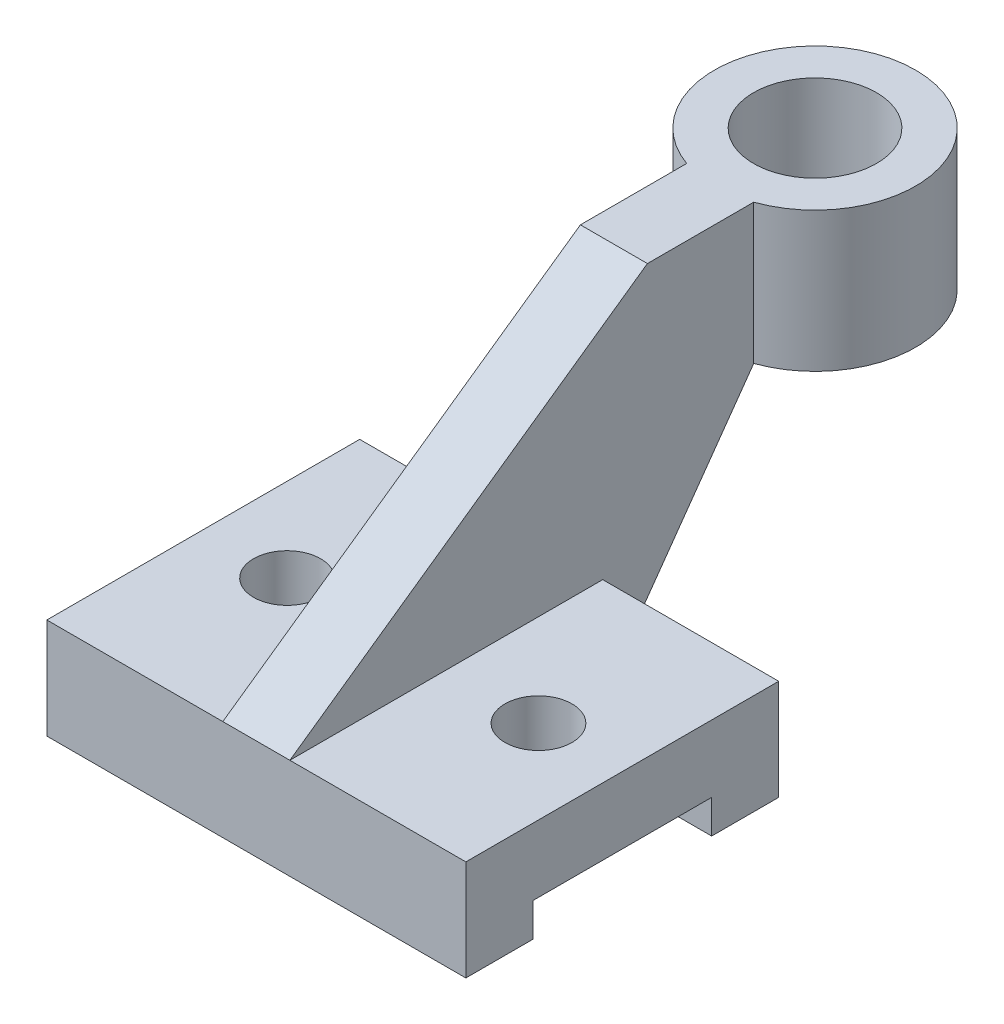
ISO-10303-21;
HEADER;
FILE_DESCRIPTION(('STEP AP214'),'2;1');
FILE_NAME('part.step','',(''),(''),'','','');
FILE_SCHEMA(('AUTOMOTIVE_DESIGN { 1 0 10303 214 1 1 1 1 }'));
ENDSEC;
DATA;
#1=APPLICATION_CONTEXT('core data for automotive mechanical design processes');
#2=APPLICATION_PROTOCOL_DEFINITION('international standard','automotive_design',2000,#1);
#3=PRODUCT_CONTEXT('',#1,'mechanical');
#4=PRODUCT('Part','Part','',(#3));
#5=PRODUCT_RELATED_PRODUCT_CATEGORY('part','',(#4));
#6=PRODUCT_DEFINITION_FORMATION('','',#4);
#7=PRODUCT_DEFINITION_CONTEXT('part definition',#1,'design');
#8=PRODUCT_DEFINITION('design','',#6,#7);
#9=PRODUCT_DEFINITION_SHAPE('','',#8);
#10=(LENGTH_UNIT() NAMED_UNIT(*) SI_UNIT(.MILLI.,.METRE.));
#11=(NAMED_UNIT(*) PLANE_ANGLE_UNIT() SI_UNIT($,.RADIAN.));
#12=(NAMED_UNIT(*) SI_UNIT($,.STERADIAN.) SOLID_ANGLE_UNIT());
#13=UNCERTAINTY_MEASURE_WITH_UNIT(LENGTH_MEASURE(1.E-05),#10,'distance_accuracy_value','');
#14=(GEOMETRIC_REPRESENTATION_CONTEXT(3) GLOBAL_UNCERTAINTY_ASSIGNED_CONTEXT((#13)) GLOBAL_UNIT_ASSIGNED_CONTEXT((#10,
#11,#12)) REPRESENTATION_CONTEXT('',''));
#15=CARTESIAN_POINT('',(0.,0.,0.));
#16=DIRECTION('',(0.,0.,1.));
#17=DIRECTION('',(1.,0.,0.));
#18=AXIS2_PLACEMENT_3D('',#15,#16,#17);
#19=CARTESIAN_POINT('',(-37.5,18.,-28.));
#20=DIRECTION('',(0.,0.,1.));
#21=DIRECTION('',(1.,0.,0.));
#22=AXIS2_PLACEMENT_3D('',#19,#20,#21);
#23=PLANE('',#22);
#24=DIRECTION('',(0.,-1.,0.));
#25=VECTOR('',#24,1.);
#26=CARTESIAN_POINT('',(6.,18.,-28.));
#27=LINE('',#26,#25);
#28=CARTESIAN_POINT('',(6.,18.,-28.));
#29=VERTEX_POINT('',#28);
#30=CARTESIAN_POINT('',(6.,0.,-28.));
#31=VERTEX_POINT('',#30);
#32=EDGE_CURVE('E184',#29,#31,#27,.T.);
#33=ORIENTED_EDGE('',*,*,#32,.F.);
#34=DIRECTION('',(-1.,0.,0.));
#35=VECTOR('',#34,1.);
#36=CARTESIAN_POINT('',(-37.5,18.,-28.));
#37=LINE('',#36,#35);
#38=CARTESIAN_POINT('',(37.5,18.,-28.));
#39=VERTEX_POINT('',#38);
#40=EDGE_CURVE('E246',#39,#29,#37,.T.);
#41=ORIENTED_EDGE('',*,*,#40,.F.);
#42=DIRECTION('',(0.,-1.,0.));
#43=VECTOR('',#42,1.);
#44=CARTESIAN_POINT('',(37.5,18.,-28.));
#45=LINE('',#44,#43);
#46=CARTESIAN_POINT('',(37.5,0.,-28.));
#47=VERTEX_POINT('',#46);
#48=EDGE_CURVE('E11',#39,#47,#45,.T.);
#49=ORIENTED_EDGE('',*,*,#48,.T.);
#50=DIRECTION('',(-1.,0.,0.));
#51=VECTOR('',#50,1.);
#52=CARTESIAN_POINT('',(-37.5,0.,-28.));
#53=LINE('',#52,#51);
#54=EDGE_CURVE('E258',#47,#31,#53,.T.);
#55=ORIENTED_EDGE('',*,*,#54,.T.);
#56=EDGE_LOOP('',(#33,#41,#49,#55));
#57=FACE_BOUND('',#56,.T.);
#58=ADVANCED_FACE('F39',(#57),#23,.F.);
#59=CARTESIAN_POINT('',(0.,18.,0.));
#60=DIRECTION('',(0.,-1.,0.));
#61=DIRECTION('',(0.,0.,-1.));
#62=AXIS2_PLACEMENT_3D('',#59,#60,#61);
#63=PLANE('',#62);
#64=CARTESIAN_POINT('',(22.5,18.,0.));
#65=DIRECTION('',(0.,1.,0.));
#66=DIRECTION('',(0.,0.,1.));
#67=AXIS2_PLACEMENT_3D('',#64,#65,#66);
#68=CIRCLE('',#67,6.);
#69=CARTESIAN_POINT('',(22.5,18.,6.));
#70=VERTEX_POINT('',#69);
#71=EDGE_CURVE('E237',#70,#70,#68,.T.);
#72=ORIENTED_EDGE('',*,*,#71,.F.);
#73=EDGE_LOOP('',(#72));
#74=FACE_BOUND('',#73,.T.);
#75=DIRECTION('',(0.,0.,-1.));
#76=VECTOR('',#75,1.);
#77=CARTESIAN_POINT('',(6.,18.,28.));
#78=LINE('',#77,#76);
#79=CARTESIAN_POINT('',(6.,18.,28.));
#80=VERTEX_POINT('',#79);
#81=EDGE_CURVE('E55',#80,#29,#78,.T.);
#82=ORIENTED_EDGE('',*,*,#81,.F.);
#83=DIRECTION('',(1.,0.,0.));
#84=VECTOR('',#83,1.);
#85=CARTESIAN_POINT('',(-37.5,18.,28.));
#86=LINE('',#85,#84);
#87=CARTESIAN_POINT('',(37.5,18.,28.));
#88=VERTEX_POINT('',#87);
#89=EDGE_CURVE('E250',#80,#88,#86,.T.);
#90=ORIENTED_EDGE('',*,*,#89,.T.);
#91=DIRECTION('',(0.,0.,-1.));
#92=VECTOR('',#91,1.);
#93=CARTESIAN_POINT('',(37.5,18.,28.));
#94=LINE('',#93,#92);
#95=EDGE_CURVE('E241',#88,#39,#94,.T.);
#96=ORIENTED_EDGE('',*,*,#95,.T.);
#97=ORIENTED_EDGE('',*,*,#40,.T.);
#98=EDGE_LOOP('',(#82,#90,#96,#97));
#99=FACE_BOUND('',#98,.T.);
#100=ADVANCED_FACE('F306',(#74,#99),#63,.F.);
#101=CARTESIAN_POINT('',(0.,0.,0.));
#102=DIRECTION('',(0.,-1.,0.));
#103=DIRECTION('',(0.,0.,-1.));
#104=AXIS2_PLACEMENT_3D('',#101,#102,#103);
#105=PLANE('',#104);
#106=DIRECTION('',(1.,0.,0.));
#107=VECTOR('',#106,1.);
#108=CARTESIAN_POINT('',(-37.5,0.,16.));
#109=LINE('',#108,#107);
#110=CARTESIAN_POINT('',(-37.5,0.,16.));
#111=VERTEX_POINT('',#110);
#112=CARTESIAN_POINT('',(37.5,0.,16.));
#113=VERTEX_POINT('',#112);
#114=EDGE_CURVE('E223',#111,#113,#109,.T.);
#115=ORIENTED_EDGE('',*,*,#114,.T.);
#116=DIRECTION('',(0.,0.,-1.));
#117=VECTOR('',#116,1.);
#118=CARTESIAN_POINT('',(37.5,0.,28.));
#119=LINE('',#118,#117);
#120=CARTESIAN_POINT('',(37.5,0.,28.));
#121=VERTEX_POINT('',#120);
#122=EDGE_CURVE('E254',#121,#113,#119,.T.);
#123=ORIENTED_EDGE('',*,*,#122,.F.);
#124=DIRECTION('',(1.,0.,0.));
#125=VECTOR('',#124,1.);
#126=CARTESIAN_POINT('',(-37.5,0.,28.));
#127=LINE('',#126,#125);
#128=CARTESIAN_POINT('',(-37.5,0.,28.));
#129=VERTEX_POINT('',#128);
#130=EDGE_CURVE('E245',#129,#121,#127,.T.);
#131=ORIENTED_EDGE('',*,*,#130,.F.);
#132=DIRECTION('',(0.,0.,1.));
#133=VECTOR('',#132,1.);
#134=CARTESIAN_POINT('',(-37.5,0.,28.));
#135=LINE('',#134,#133);
#136=EDGE_CURVE('E261',#111,#129,#135,.T.);
#137=ORIENTED_EDGE('',*,*,#136,.F.);
#138=EDGE_LOOP('',(#115,#123,#131,#137));
#139=FACE_BOUND('',#138,.T.);
#140=ADVANCED_FACE('F301',(#139),#105,.T.);
#141=CARTESIAN_POINT('',(37.5,18.,28.));
#142=DIRECTION('',(-1.,0.,0.));
#143=DIRECTION('',(0.,0.,1.));
#144=AXIS2_PLACEMENT_3D('',#141,#142,#143);
#145=PLANE('',#144);
#146=ORIENTED_EDGE('',*,*,#122,.T.);
#147=DIRECTION('',(0.,-1.,0.));
#148=VECTOR('',#147,1.);
#149=CARTESIAN_POINT('',(37.5,0.,16.));
#150=LINE('',#149,#148);
#151=CARTESIAN_POINT('',(37.5,6.,16.));
#152=VERTEX_POINT('',#151);
#153=EDGE_CURVE('E210',#152,#113,#150,.T.);
#154=ORIENTED_EDGE('',*,*,#153,.F.);
#155=DIRECTION('',(0.,0.,1.));
#156=VECTOR('',#155,1.);
#157=CARTESIAN_POINT('',(37.5,6.,16.));
#158=LINE('',#157,#156);
#159=CARTESIAN_POINT('',(37.5,6.,-16.));
#160=VERTEX_POINT('',#159);
#161=EDGE_CURVE('E219',#160,#152,#158,.T.);
#162=ORIENTED_EDGE('',*,*,#161,.F.);
#163=DIRECTION('',(0.,1.,0.));
#164=VECTOR('',#163,1.);
#165=CARTESIAN_POINT('',(37.5,0.,-16.));
#166=LINE('',#165,#164);
#167=CARTESIAN_POINT('',(37.5,0.,-16.));
#168=VERTEX_POINT('',#167);
#169=EDGE_CURVE('E205',#168,#160,#166,.T.);
#170=ORIENTED_EDGE('',*,*,#169,.F.);
#171=EDGE_CURVE('E240',#168,#47,#119,.T.);
#172=ORIENTED_EDGE('',*,*,#171,.T.);
#173=ORIENTED_EDGE('',*,*,#48,.F.);
#174=ORIENTED_EDGE('',*,*,#95,.F.);
#175=DIRECTION('',(0.,-1.,0.));
#176=VECTOR('',#175,1.);
#177=CARTESIAN_POINT('',(37.5,18.,28.));
#178=LINE('',#177,#176);
#179=EDGE_CURVE('E253',#88,#121,#178,.T.);
#180=ORIENTED_EDGE('',*,*,#179,.T.);
#181=EDGE_LOOP('',(#146,#154,#162,#170,#172,#173,#174,#180));
#182=FACE_BOUND('',#181,.T.);
#183=ADVANCED_FACE('F41',(#182),#145,.F.);
#184=CARTESIAN_POINT('',(-6.,18.,-28.));
#185=VERTEX_POINT('',#184);
#186=CARTESIAN_POINT('',(-37.5,18.,-28.));
#187=VERTEX_POINT('',#186);
#188=EDGE_CURVE('E244',#185,#187,#37,.T.);
#189=ORIENTED_EDGE('',*,*,#188,.F.);
#190=DIRECTION('',(0.,-1.,0.));
#191=VECTOR('',#190,1.);
#192=CARTESIAN_POINT('',(-6.,18.,-28.));
#193=LINE('',#192,#191);
#194=CARTESIAN_POINT('',(-6.,0.,-28.));
#195=VERTEX_POINT('',#194);
#196=EDGE_CURVE('E193',#185,#195,#193,.T.);
#197=ORIENTED_EDGE('',*,*,#196,.T.);
#198=CARTESIAN_POINT('',(-37.5,0.,-28.));
#199=VERTEX_POINT('',#198);
#200=EDGE_CURVE('E257',#195,#199,#53,.T.);
#201=ORIENTED_EDGE('',*,*,#200,.T.);
#202=DIRECTION('',(0.,-1.,0.));
#203=VECTOR('',#202,1.);
#204=CARTESIAN_POINT('',(-37.5,18.,-28.));
#205=LINE('',#204,#203);
#206=EDGE_CURVE('E48',#187,#199,#205,.T.);
#207=ORIENTED_EDGE('',*,*,#206,.F.);
#208=EDGE_LOOP('',(#189,#197,#201,#207));
#209=FACE_BOUND('',#208,.T.);
#210=ADVANCED_FACE('F314',(#209),#23,.F.);
#211=CARTESIAN_POINT('',(-37.5,18.,28.));
#212=DIRECTION('',(1.,0.,0.));
#213=DIRECTION('',(0.,0.,-1.));
#214=AXIS2_PLACEMENT_3D('',#211,#212,#213);
#215=PLANE('',#214);
#216=DIRECTION('',(0.,0.,1.));
#217=VECTOR('',#216,1.);
#218=CARTESIAN_POINT('',(-37.5,6.,16.));
#219=LINE('',#218,#217);
#220=CARTESIAN_POINT('',(-37.5,6.,-16.));
#221=VERTEX_POINT('',#220);
#222=CARTESIAN_POINT('',(-37.5,6.,16.));
#223=VERTEX_POINT('',#222);
#224=EDGE_CURVE('E209',#221,#223,#219,.T.);
#225=ORIENTED_EDGE('',*,*,#224,.T.);
#226=DIRECTION('',(0.,-1.,0.));
#227=VECTOR('',#226,1.);
#228=CARTESIAN_POINT('',(-37.5,0.,16.));
#229=LINE('',#228,#227);
#230=EDGE_CURVE('E213',#223,#111,#229,.T.);
#231=ORIENTED_EDGE('',*,*,#230,.T.);
#232=ORIENTED_EDGE('',*,*,#136,.T.);
#233=DIRECTION('',(0.,-1.,0.));
#234=VECTOR('',#233,1.);
#235=CARTESIAN_POINT('',(-37.5,18.,28.));
#236=LINE('',#235,#234);
#237=CARTESIAN_POINT('',(-37.5,18.,28.));
#238=VERTEX_POINT('',#237);
#239=EDGE_CURVE('E268',#238,#129,#236,.T.);
#240=ORIENTED_EDGE('',*,*,#239,.F.);
#241=DIRECTION('',(0.,0.,1.));
#242=VECTOR('',#241,1.);
#243=CARTESIAN_POINT('',(-37.5,18.,28.));
#244=LINE('',#243,#242);
#245=EDGE_CURVE('E248',#187,#238,#244,.T.);
#246=ORIENTED_EDGE('',*,*,#245,.F.);
#247=ORIENTED_EDGE('',*,*,#206,.T.);
#248=CARTESIAN_POINT('',(-37.5,0.,-16.));
#249=VERTEX_POINT('',#248);
#250=EDGE_CURVE('E262',#199,#249,#135,.T.);
#251=ORIENTED_EDGE('',*,*,#250,.T.);
#252=DIRECTION('',(0.,1.,0.));
#253=VECTOR('',#252,1.);
#254=CARTESIAN_POINT('',(-37.5,0.,-16.));
#255=LINE('',#254,#253);
#256=EDGE_CURVE('E206',#249,#221,#255,.T.);
#257=ORIENTED_EDGE('',*,*,#256,.T.);
#258=EDGE_LOOP('',(#225,#231,#232,#240,#246,#247,#251,#257));
#259=FACE_BOUND('',#258,.T.);
#260=ADVANCED_FACE('F276',(#259),#215,.F.);
#261=CARTESIAN_POINT('',(-37.5,18.,28.));
#262=DIRECTION('',(0.,0.,-1.));
#263=DIRECTION('',(-1.,0.,0.));
#264=AXIS2_PLACEMENT_3D('',#261,#262,#263);
#265=PLANE('',#264);
#266=ORIENTED_EDGE('',*,*,#130,.T.);
#267=ORIENTED_EDGE('',*,*,#179,.F.);
#268=ORIENTED_EDGE('',*,*,#89,.F.);
#269=DIRECTION('',(-1.,0.,0.));
#270=VECTOR('',#269,1.);
#271=CARTESIAN_POINT('',(6.,18.,28.));
#272=LINE('',#271,#270);
#273=CARTESIAN_POINT('',(-6.,18.,28.));
#274=VERTEX_POINT('',#273);
#275=EDGE_CURVE('E62',#80,#274,#272,.T.);
#276=ORIENTED_EDGE('',*,*,#275,.T.);
#277=EDGE_CURVE('E251',#238,#274,#86,.T.);
#278=ORIENTED_EDGE('',*,*,#277,.F.);
#279=ORIENTED_EDGE('',*,*,#239,.T.);
#280=EDGE_LOOP('',(#266,#267,#268,#276,#278,#279));
#281=FACE_BOUND('',#280,.T.);
#282=ADVANCED_FACE('F304',(#281),#265,.F.);
#283=CARTESIAN_POINT('',(-22.5,18.,0.));
#284=DIRECTION('',(0.,-1.,0.));
#285=DIRECTION('',(0.,0.,1.));
#286=AXIS2_PLACEMENT_3D('',#283,#284,#285);
#287=CIRCLE('',#286,6.);
#288=CARTESIAN_POINT('',(-22.5,18.,6.));
#289=VERTEX_POINT('',#288);
#290=EDGE_CURVE('E234',#289,#289,#287,.T.);
#291=ORIENTED_EDGE('',*,*,#290,.T.);
#292=EDGE_LOOP('',(#291));
#293=FACE_BOUND('',#292,.T.);
#294=ORIENTED_EDGE('',*,*,#277,.T.);
#295=DIRECTION('',(0.,0.,-1.));
#296=VECTOR('',#295,1.);
#297=CARTESIAN_POINT('',(-6.,18.,28.));
#298=LINE('',#297,#296);
#299=EDGE_CURVE('E191',#274,#185,#298,.T.);
#300=ORIENTED_EDGE('',*,*,#299,.T.);
#301=ORIENTED_EDGE('',*,*,#188,.T.);
#302=ORIENTED_EDGE('',*,*,#245,.T.);
#303=EDGE_LOOP('',(#294,#300,#301,#302));
#304=FACE_BOUND('',#303,.T.);
#305=ADVANCED_FACE('F313',(#293,#304),#63,.F.);
#306=DIRECTION('',(1.,0.,0.));
#307=VECTOR('',#306,1.);
#308=CARTESIAN_POINT('',(-37.5,0.,-16.));
#309=LINE('',#308,#307);
#310=EDGE_CURVE('E216',#249,#168,#309,.T.);
#311=ORIENTED_EDGE('',*,*,#310,.F.);
#312=ORIENTED_EDGE('',*,*,#250,.F.);
#313=ORIENTED_EDGE('',*,*,#200,.F.);
#314=DIRECTION('',(-1.,0.,0.));
#315=VECTOR('',#314,1.);
#316=CARTESIAN_POINT('',(6.,0.,-28.));
#317=LINE('',#316,#315);
#318=EDGE_CURVE('E199',#31,#195,#317,.T.);
#319=ORIENTED_EDGE('',*,*,#318,.F.);
#320=ORIENTED_EDGE('',*,*,#54,.F.);
#321=ORIENTED_EDGE('',*,*,#171,.F.);
#322=EDGE_LOOP('',(#311,#312,#313,#319,#320,#321));
#323=FACE_BOUND('',#322,.T.);
#324=ADVANCED_FACE('F282',(#323),#105,.T.);
#325=CARTESIAN_POINT('',(22.5,0.,0.));
#326=DIRECTION('',(0.,1.,0.));
#327=DIRECTION('',(0.,0.,1.));
#328=AXIS2_PLACEMENT_3D('',#325,#326,#327);
#329=CYLINDRICAL_SURFACE('',#328,6.);
#330=CARTESIAN_POINT('',(22.5,6.,0.));
#331=DIRECTION('',(0.,1.,0.));
#332=DIRECTION('',(0.,0.,1.));
#333=AXIS2_PLACEMENT_3D('',#330,#331,#332);
#334=CIRCLE('',#333,6.);
#335=CARTESIAN_POINT('',(22.5,6.,6.));
#336=VERTEX_POINT('',#335);
#337=EDGE_CURVE('E231',#336,#336,#334,.F.);
#338=ORIENTED_EDGE('',*,*,#337,.T.);
#339=EDGE_LOOP('',(#338));
#340=FACE_BOUND('',#339,.T.);
#341=ORIENTED_EDGE('',*,*,#71,.T.);
#342=EDGE_LOOP('',(#341));
#343=FACE_BOUND('',#342,.T.);
#344=ADVANCED_FACE('F356',(#340,#343),#329,.F.);
#345=CARTESIAN_POINT('',(-22.5,0.,0.));
#346=DIRECTION('',(0.,1.,0.));
#347=DIRECTION('',(0.,0.,1.));
#348=AXIS2_PLACEMENT_3D('',#345,#346,#347);
#349=CYLINDRICAL_SURFACE('',#348,6.);
#350=CARTESIAN_POINT('',(-22.5,6.,0.));
#351=DIRECTION('',(0.,1.,0.));
#352=DIRECTION('',(0.,0.,1.));
#353=AXIS2_PLACEMENT_3D('',#350,#351,#352);
#354=CIRCLE('',#353,6.);
#355=CARTESIAN_POINT('',(-22.5,6.,6.));
#356=VERTEX_POINT('',#355);
#357=EDGE_CURVE('E43',#356,#356,#354,.T.);
#358=ORIENTED_EDGE('',*,*,#357,.F.);
#359=EDGE_LOOP('',(#358));
#360=FACE_BOUND('',#359,.T.);
#361=ORIENTED_EDGE('',*,*,#290,.F.);
#362=EDGE_LOOP('',(#361));
#363=FACE_BOUND('',#362,.T.);
#364=ADVANCED_FACE('F362',(#360,#363),#349,.F.);
#365=CARTESIAN_POINT('',(-37.5,6.,16.));
#366=DIRECTION('',(0.,1.,0.));
#367=DIRECTION('',(0.,0.,1.));
#368=AXIS2_PLACEMENT_3D('',#365,#366,#367);
#369=PLANE('',#368);
#370=ORIENTED_EDGE('',*,*,#161,.T.);
#371=DIRECTION('',(1.,0.,0.));
#372=VECTOR('',#371,1.);
#373=CARTESIAN_POINT('',(-37.5,6.,16.));
#374=LINE('',#373,#372);
#375=EDGE_CURVE('E226',#223,#152,#374,.T.);
#376=ORIENTED_EDGE('',*,*,#375,.F.);
#377=ORIENTED_EDGE('',*,*,#224,.F.);
#378=DIRECTION('',(1.,0.,0.));
#379=VECTOR('',#378,1.);
#380=CARTESIAN_POINT('',(-37.5,6.,-16.));
#381=LINE('',#380,#379);
#382=EDGE_CURVE('E228',#221,#160,#381,.T.);
#383=ORIENTED_EDGE('',*,*,#382,.T.);
#384=EDGE_LOOP('',(#370,#376,#377,#383));
#385=FACE_BOUND('',#384,.T.);
#386=ORIENTED_EDGE('',*,*,#357,.T.);
#387=EDGE_LOOP('',(#386));
#388=FACE_BOUND('',#387,.T.);
#389=ORIENTED_EDGE('',*,*,#337,.F.);
#390=EDGE_LOOP('',(#389));
#391=FACE_BOUND('',#390,.T.);
#392=ADVANCED_FACE('F293',(#385,#388,#391),#369,.F.);
#393=CARTESIAN_POINT('',(-37.5,0.,16.));
#394=DIRECTION('',(0.,0.,1.));
#395=DIRECTION('',(1.,0.,0.));
#396=AXIS2_PLACEMENT_3D('',#393,#394,#395);
#397=PLANE('',#396);
#398=ORIENTED_EDGE('',*,*,#153,.T.);
#399=ORIENTED_EDGE('',*,*,#114,.F.);
#400=ORIENTED_EDGE('',*,*,#230,.F.);
#401=ORIENTED_EDGE('',*,*,#375,.T.);
#402=EDGE_LOOP('',(#398,#399,#400,#401));
#403=FACE_BOUND('',#402,.T.);
#404=ADVANCED_FACE('F373',(#403),#397,.F.);
#405=CARTESIAN_POINT('',(-37.5,0.,-16.));
#406=DIRECTION('',(0.,0.,-1.));
#407=DIRECTION('',(-1.,0.,0.));
#408=AXIS2_PLACEMENT_3D('',#405,#406,#407);
#409=PLANE('',#408);
#410=ORIENTED_EDGE('',*,*,#169,.T.);
#411=ORIENTED_EDGE('',*,*,#382,.F.);
#412=ORIENTED_EDGE('',*,*,#256,.F.);
#413=ORIENTED_EDGE('',*,*,#310,.T.);
#414=EDGE_LOOP('',(#410,#411,#412,#413));
#415=FACE_BOUND('',#414,.T.);
#416=ADVANCED_FACE('F287',(#415),#409,.F.);
#417=CARTESIAN_POINT('',(6.,63.,-36.));
#418=DIRECTION('',(0.,-0.818029158386142,-0.575176751990256));
#419=DIRECTION('',(0.,0.575176751990256,-0.818029158386142));
#420=AXIS2_PLACEMENT_3D('',#417,#418,#419);
#421=PLANE('',#420);
#422=DIRECTION('',(0.,-0.575176751990256,0.818029158386142));
#423=VECTOR('',#422,1.);
#424=CARTESIAN_POINT('',(-6.,63.,-36.));
#425=LINE('',#424,#423);
#426=CARTESIAN_POINT('',(-6.,63.,-36.));
#427=VERTEX_POINT('',#426);
#428=EDGE_CURVE('E152',#427,#274,#425,.T.);
#429=ORIENTED_EDGE('',*,*,#428,.T.);
#430=ORIENTED_EDGE('',*,*,#275,.F.);
#431=DIRECTION('',(0.,-0.575176751990256,0.818029158386142));
#432=VECTOR('',#431,1.);
#433=CARTESIAN_POINT('',(6.,63.,-36.));
#434=LINE('',#433,#432);
#435=CARTESIAN_POINT('',(6.,63.,-36.));
#436=VERTEX_POINT('',#435);
#437=EDGE_CURVE('E179',#436,#80,#434,.T.);
#438=ORIENTED_EDGE('',*,*,#437,.F.);
#439=DIRECTION('',(-1.,0.,0.));
#440=VECTOR('',#439,1.);
#441=CARTESIAN_POINT('',(6.,63.,-36.));
#442=LINE('',#441,#440);
#443=EDGE_CURVE('E203',#436,#427,#442,.T.);
#444=ORIENTED_EDGE('',*,*,#443,.T.);
#445=EDGE_LOOP('',(#429,#430,#438,#444));
#446=FACE_BOUND('',#445,.T.);
#447=ADVANCED_FACE('F310',(#446),#421,.F.);
#448=CARTESIAN_POINT('',(6.,0.,-28.));
#449=DIRECTION('',(0.,0.579626540065055,0.814882245512941));
#450=DIRECTION('',(0.,-0.814882245512941,0.579626540065055));
#451=AXIS2_PLACEMENT_3D('',#448,#449,#450);
#452=PLANE('',#451);
#453=DIRECTION('',(0.,0.814882245512941,-0.579626540065055));
#454=VECTOR('',#453,1.);
#455=CARTESIAN_POINT('',(-6.,0.,-28.));
#456=LINE('',#455,#454);
#457=CARTESIAN_POINT('',(-6.,38.,-55.0294372515229));
#458=VERTEX_POINT('',#457);
#459=EDGE_CURVE('E182',#195,#458,#456,.T.);
#460=ORIENTED_EDGE('',*,*,#459,.T.);
#461=DIRECTION('',(-1.,0.,0.));
#462=VECTOR('',#461,1.);
#463=CARTESIAN_POINT('',(6.,38.,-55.0294372515229));
#464=LINE('',#463,#462);
#465=CARTESIAN_POINT('',(6.,38.,-55.0294372515229));
#466=VERTEX_POINT('',#465);
#467=EDGE_CURVE('E189',#466,#458,#464,.T.);
#468=ORIENTED_EDGE('',*,*,#467,.F.);
#469=DIRECTION('',(0.,0.814882245512941,-0.579626540065055));
#470=VECTOR('',#469,1.);
#471=CARTESIAN_POINT('',(6.,0.,-28.));
#472=LINE('',#471,#470);
#473=EDGE_CURVE('E187',#31,#466,#472,.T.);
#474=ORIENTED_EDGE('',*,*,#473,.F.);
#475=ORIENTED_EDGE('',*,*,#318,.T.);
#476=EDGE_LOOP('',(#460,#468,#474,#475));
#477=FACE_BOUND('',#476,.T.);
#478=ADVANCED_FACE('F317',(#477),#452,.F.);
#479=CARTESIAN_POINT('',(6.,0.,0.));
#480=DIRECTION('',(-1.,0.,0.));
#481=DIRECTION('',(0.,0.,1.));
#482=AXIS2_PLACEMENT_3D('',#479,#480,#481);
#483=PLANE('',#482);
#484=ORIENTED_EDGE('',*,*,#473,.T.);
#485=DIRECTION('',(0.,1.,0.));
#486=VECTOR('',#485,1.);
#487=CARTESIAN_POINT('',(6.,38.,-55.0294372515229));
#488=LINE('',#487,#486);
#489=CARTESIAN_POINT('',(6.,63.,-55.0294372515229));
#490=VERTEX_POINT('',#489);
#491=EDGE_CURVE('E157',#466,#490,#488,.T.);
#492=ORIENTED_EDGE('',*,*,#491,.T.);
#493=DIRECTION('',(0.,0.,1.));
#494=VECTOR('',#493,1.);
#495=CARTESIAN_POINT('',(6.,63.,-90.002));
#496=LINE('',#495,#494);
#497=EDGE_CURVE('E156',#490,#436,#496,.T.);
#498=ORIENTED_EDGE('',*,*,#497,.T.);
#499=ORIENTED_EDGE('',*,*,#437,.T.);
#500=ORIENTED_EDGE('',*,*,#81,.T.);
#501=ORIENTED_EDGE('',*,*,#32,.T.);
#502=EDGE_LOOP('',(#484,#492,#498,#499,#500,#501));
#503=FACE_BOUND('',#502,.T.);
#504=ADVANCED_FACE('F308',(#503),#483,.F.);
#505=CARTESIAN_POINT('',(-6.,0.,0.));
#506=DIRECTION('',(-1.,0.,0.));
#507=DIRECTION('',(0.,0.,1.));
#508=AXIS2_PLACEMENT_3D('',#505,#506,#507);
#509=PLANE('',#508);
#510=ORIENTED_EDGE('',*,*,#428,.F.);
#511=DIRECTION('',(0.,0.,1.));
#512=VECTOR('',#511,1.);
#513=CARTESIAN_POINT('',(-6.,63.,-90.002));
#514=LINE('',#513,#512);
#515=CARTESIAN_POINT('',(-6.,63.,-55.0294372515229));
#516=VERTEX_POINT('',#515);
#517=EDGE_CURVE('E144',#516,#427,#514,.T.);
#518=ORIENTED_EDGE('',*,*,#517,.F.);
#519=DIRECTION('',(0.,1.,0.));
#520=VECTOR('',#519,1.);
#521=CARTESIAN_POINT('',(-6.,38.,-55.0294372515229));
#522=LINE('',#521,#520);
#523=EDGE_CURVE('E148',#516,#458,#522,.F.);
#524=ORIENTED_EDGE('',*,*,#523,.T.);
#525=ORIENTED_EDGE('',*,*,#459,.F.);
#526=ORIENTED_EDGE('',*,*,#196,.F.);
#527=ORIENTED_EDGE('',*,*,#299,.F.);
#528=EDGE_LOOP('',(#510,#518,#524,#525,#526,#527));
#529=FACE_BOUND('',#528,.T.);
#530=ADVANCED_FACE('F146',(#529),#509,.T.);
#531=CARTESIAN_POINT('',(0.,38.,-72.));
#532=DIRECTION('',(0.,-1.,0.));
#533=DIRECTION('',(0.,0.,-1.));
#534=AXIS2_PLACEMENT_3D('',#531,#532,#533);
#535=PLANE('',#534);
#536=CARTESIAN_POINT('',(0.,38.,-72.));
#537=DIRECTION('',(0.,-1.,0.));
#538=DIRECTION('',(0.,0.,-1.));
#539=AXIS2_PLACEMENT_3D('',#536,#537,#538);
#540=CIRCLE('',#539,11.);
#541=CARTESIAN_POINT('',(0.,38.,-83.));
#542=VERTEX_POINT('',#541);
#543=EDGE_CURVE('E171',#542,#542,#540,.T.);
#544=ORIENTED_EDGE('',*,*,#543,.F.);
#545=EDGE_LOOP('',(#544));
#546=FACE_BOUND('',#545,.T.);
#547=ORIENTED_EDGE('',*,*,#467,.T.);
#548=CARTESIAN_POINT('',(0.,38.,-72.));
#549=DIRECTION('',(0.,-1.,0.));
#550=DIRECTION('',(0.,0.,-1.));
#551=AXIS2_PLACEMENT_3D('',#548,#549,#550);
#552=CIRCLE('',#551,18.);
#553=EDGE_CURVE('E165',#458,#466,#552,.T.);
#554=ORIENTED_EDGE('',*,*,#553,.T.);
#555=EDGE_LOOP('',(#547,#554));
#556=FACE_BOUND('',#555,.T.);
#557=ADVANCED_FACE('F322',(#546,#556),#535,.T.);
#558=CARTESIAN_POINT('',(0.,63.,-72.));
#559=DIRECTION('',(0.,-1.,0.));
#560=DIRECTION('',(0.,0.,-1.));
#561=AXIS2_PLACEMENT_3D('',#558,#559,#560);
#562=PLANE('',#561);
#563=CARTESIAN_POINT('',(0.,63.,-72.));
#564=DIRECTION('',(0.,-1.,0.));
#565=DIRECTION('',(0.,0.,-1.));
#566=AXIS2_PLACEMENT_3D('',#563,#564,#565);
#567=CIRCLE('',#566,18.);
#568=EDGE_CURVE('E163',#516,#490,#567,.T.);
#569=ORIENTED_EDGE('',*,*,#568,.F.);
#570=ORIENTED_EDGE('',*,*,#517,.T.);
#571=ORIENTED_EDGE('',*,*,#443,.F.);
#572=ORIENTED_EDGE('',*,*,#497,.F.);
#573=EDGE_LOOP('',(#569,#570,#571,#572));
#574=FACE_BOUND('',#573,.T.);
#575=CARTESIAN_POINT('',(0.,63.,-72.));
#576=DIRECTION('',(0.,-1.,0.));
#577=DIRECTION('',(0.,0.,-1.));
#578=AXIS2_PLACEMENT_3D('',#575,#576,#577);
#579=CIRCLE('',#578,11.);
#580=CARTESIAN_POINT('',(0.,63.,-83.));
#581=VERTEX_POINT('',#580);
#582=EDGE_CURVE('E175',#581,#581,#579,.T.);
#583=ORIENTED_EDGE('',*,*,#582,.T.);
#584=EDGE_LOOP('',(#583));
#585=FACE_BOUND('',#584,.T.);
#586=ADVANCED_FACE('F168',(#574,#585),#562,.F.);
#587=CARTESIAN_POINT('',(0.,38.,-72.));
#588=DIRECTION('',(0.,1.,0.));
#589=DIRECTION('',(0.,0.,1.));
#590=AXIS2_PLACEMENT_3D('',#587,#588,#589);
#591=CYLINDRICAL_SURFACE('',#590,18.);
#592=ORIENTED_EDGE('',*,*,#553,.F.);
#593=ORIENTED_EDGE('',*,*,#523,.F.);
#594=ORIENTED_EDGE('',*,*,#568,.T.);
#595=ORIENTED_EDGE('',*,*,#491,.F.);
#596=EDGE_LOOP('',(#592,#593,#594,#595));
#597=FACE_BOUND('',#596,.T.);
#598=ADVANCED_FACE('F161',(#597),#591,.T.);
#599=CARTESIAN_POINT('',(0.,38.,-72.));
#600=DIRECTION('',(0.,1.,0.));
#601=DIRECTION('',(0.,0.,1.));
#602=AXIS2_PLACEMENT_3D('',#599,#600,#601);
#603=CYLINDRICAL_SURFACE('',#602,11.);
#604=ORIENTED_EDGE('',*,*,#543,.T.);
#605=EDGE_LOOP('',(#604));
#606=FACE_BOUND('',#605,.T.);
#607=ORIENTED_EDGE('',*,*,#582,.F.);
#608=EDGE_LOOP('',(#607));
#609=FACE_BOUND('',#608,.T.);
#610=ADVANCED_FACE('F384',(#606,#609),#603,.F.);
#611=CLOSED_SHELL('',(#58,#100,#140,#183,#210,#260,#282,#305,#324,#344,#364,#392,#404,#416,#447,
#478,#504,#530,#557,#586,#598,#610));
#612=MANIFOLD_SOLID_BREP('B2',#611);
#613=ADVANCED_BREP_SHAPE_REPRESENTATION('',(#18,#612),#14);
#614=SHAPE_DEFINITION_REPRESENTATION(#9,#613);
ENDSEC;
END-ISO-10303-21;
